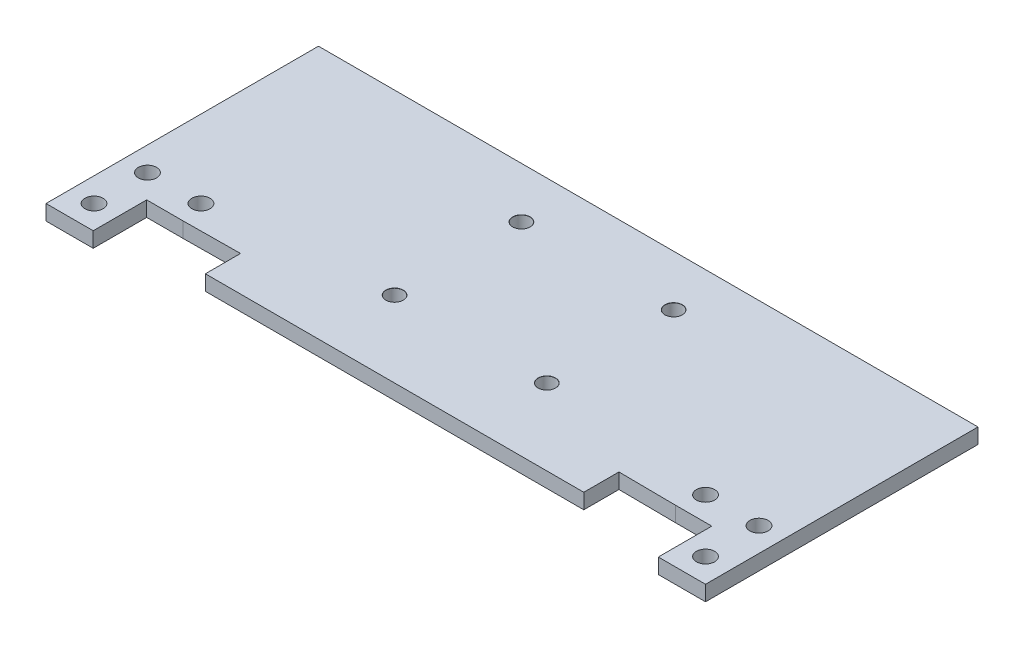
ISO-10303-21;
HEADER;
FILE_DESCRIPTION(('STEP AP214'),'2;1');
FILE_NAME('part.step','',(''),(''),'','','');
FILE_SCHEMA(('AUTOMOTIVE_DESIGN { 1 0 10303 214 1 1 1 1 }'));
ENDSEC;
DATA;
#1=APPLICATION_CONTEXT('core data for automotive mechanical design processes');
#2=APPLICATION_PROTOCOL_DEFINITION('international standard','automotive_design',2000,#1);
#3=PRODUCT_CONTEXT('',#1,'mechanical');
#4=PRODUCT('Part','Part','',(#3));
#5=PRODUCT_RELATED_PRODUCT_CATEGORY('part','',(#4));
#6=PRODUCT_DEFINITION_FORMATION('','',#4);
#7=PRODUCT_DEFINITION_CONTEXT('part definition',#1,'design');
#8=PRODUCT_DEFINITION('design','',#6,#7);
#9=PRODUCT_DEFINITION_SHAPE('','',#8);
#10=(LENGTH_UNIT() NAMED_UNIT(*) SI_UNIT(.MILLI.,.METRE.));
#11=(NAMED_UNIT(*) PLANE_ANGLE_UNIT() SI_UNIT($,.RADIAN.));
#12=(NAMED_UNIT(*) SI_UNIT($,.STERADIAN.) SOLID_ANGLE_UNIT());
#13=UNCERTAINTY_MEASURE_WITH_UNIT(LENGTH_MEASURE(1.E-05),#10,'distance_accuracy_value','');
#14=(GEOMETRIC_REPRESENTATION_CONTEXT(3) GLOBAL_UNCERTAINTY_ASSIGNED_CONTEXT((#13)) GLOBAL_UNIT_ASSIGNED_CONTEXT((#10,
#11,#12)) REPRESENTATION_CONTEXT('',''));
#15=CARTESIAN_POINT('',(0.,0.,0.));
#16=DIRECTION('',(0.,0.,1.));
#17=DIRECTION('',(1.,0.,0.));
#18=AXIS2_PLACEMENT_3D('',#15,#16,#17);
#19=CARTESIAN_POINT('',(130.,3.,-3.71));
#20=DIRECTION('',(0.,-1.,0.));
#21=DIRECTION('',(0.,0.,-1.));
#22=AXIS2_PLACEMENT_3D('',#19,#20,#21);
#23=PLANE('',#22);
#24=CARTESIAN_POINT('',(125.269900039324,3.,-4.72997846201641));
#25=DIRECTION('',(0.,1.,0.));
#26=DIRECTION('',(0.,0.,1.));
#27=AXIS2_PLACEMENT_3D('',#24,#25,#26);
#28=CIRCLE('',#27,1.8);
#29=CARTESIAN_POINT('',(125.269900039324,3.,-2.92997846201641));
#30=VERTEX_POINT('',#29);
#31=EDGE_CURVE('E545',#30,#30,#28,.T.);
#32=ORIENTED_EDGE('',*,*,#31,.F.);
#33=EDGE_LOOP('',(#32));
#34=FACE_BOUND('',#33,.T.);
#35=CARTESIAN_POINT('',(125.269900039324,3.,-15.2697785406255));
#36=DIRECTION('',(0.,1.,0.));
#37=DIRECTION('',(0.,0.,1.));
#38=AXIS2_PLACEMENT_3D('',#35,#36,#37);
#39=CIRCLE('',#38,1.8);
#40=CARTESIAN_POINT('',(125.269900039324,3.,-13.4697785406255));
#41=VERTEX_POINT('',#40);
#42=EDGE_CURVE('E551',#41,#41,#39,.T.);
#43=ORIENTED_EDGE('',*,*,#42,.F.);
#44=EDGE_LOOP('',(#43));
#45=FACE_BOUND('',#44,.T.);
#46=CARTESIAN_POINT('',(114.730099960715,3.,-15.2697785406255));
#47=DIRECTION('',(0.,1.,0.));
#48=DIRECTION('',(0.,0.,1.));
#49=AXIS2_PLACEMENT_3D('',#46,#47,#48);
#50=CIRCLE('',#49,1.79999999999998);
#51=CARTESIAN_POINT('',(114.730099960715,3.,-13.4697785406255));
#52=VERTEX_POINT('',#51);
#53=EDGE_CURVE('E557',#52,#52,#50,.T.);
#54=ORIENTED_EDGE('',*,*,#53,.F.);
#55=EDGE_LOOP('',(#54));
#56=FACE_BOUND('',#55,.T.);
#57=CARTESIAN_POINT('',(80.,3.,-18.71));
#58=DIRECTION('',(0.,1.,0.));
#59=DIRECTION('',(0.,0.,1.));
#60=AXIS2_PLACEMENT_3D('',#57,#58,#59);
#61=CIRCLE('',#60,1.725);
#62=CARTESIAN_POINT('',(80.,3.,-16.985));
#63=VERTEX_POINT('',#62);
#64=EDGE_CURVE('E254',#63,#63,#61,.T.);
#65=ORIENTED_EDGE('',*,*,#64,.F.);
#66=EDGE_LOOP('',(#65));
#67=FACE_BOUND('',#66,.T.);
#68=CARTESIAN_POINT('',(50.,3.,-18.71));
#69=DIRECTION('',(0.,1.,0.));
#70=DIRECTION('',(0.,0.,1.));
#71=AXIS2_PLACEMENT_3D('',#68,#69,#70);
#72=CIRCLE('',#71,1.725);
#73=CARTESIAN_POINT('',(50.,3.,-16.985));
#74=VERTEX_POINT('',#73);
#75=EDGE_CURVE('E245',#74,#74,#72,.T.);
#76=ORIENTED_EDGE('',*,*,#75,.F.);
#77=EDGE_LOOP('',(#76));
#78=FACE_BOUND('',#77,.T.);
#79=CARTESIAN_POINT('',(80.,3.,-43.71));
#80=DIRECTION('',(0.,1.,0.));
#81=DIRECTION('',(0.,0.,1.));
#82=AXIS2_PLACEMENT_3D('',#79,#80,#81);
#83=CIRCLE('',#82,1.725);
#84=CARTESIAN_POINT('',(80.,3.,-41.985));
#85=VERTEX_POINT('',#84);
#86=EDGE_CURVE('E236',#85,#85,#83,.T.);
#87=ORIENTED_EDGE('',*,*,#86,.F.);
#88=EDGE_LOOP('',(#87));
#89=FACE_BOUND('',#88,.T.);
#90=CARTESIAN_POINT('',(50.,3.,-43.71));
#91=DIRECTION('',(0.,1.,0.));
#92=DIRECTION('',(0.,0.,1.));
#93=AXIS2_PLACEMENT_3D('',#90,#91,#92);
#94=CIRCLE('',#93,1.725);
#95=CARTESIAN_POINT('',(50.,3.,-41.985));
#96=VERTEX_POINT('',#95);
#97=EDGE_CURVE('E227',#96,#96,#94,.T.);
#98=ORIENTED_EDGE('',*,*,#97,.F.);
#99=EDGE_LOOP('',(#98));
#100=FACE_BOUND('',#99,.T.);
#101=DIRECTION('',(0.,0.,-1.));
#102=VECTOR('',#101,1.);
#103=CARTESIAN_POINT('',(102.295589790774,3.,0.));
#104=LINE('',#103,#102);
#105=CARTESIAN_POINT('',(102.295589790774,3.,-3.71));
#106=VERTEX_POINT('',#105);
#107=CARTESIAN_POINT('',(102.295589790774,3.,-10.6394114363693));
#108=VERTEX_POINT('',#107);
#109=EDGE_CURVE('E169',#106,#108,#104,.T.);
#110=ORIENTED_EDGE('',*,*,#109,.T.);
#111=DIRECTION('',(-0.999960361646802,0.,-0.00890365852877629));
#112=VECTOR('',#111,1.);
#113=CARTESIAN_POINT('',(0.102835428158548,3.,-11.5493368932758));
#114=LINE('',#113,#112);
#115=CARTESIAN_POINT('',(113.49648019192,3.,-10.539678579773));
#116=VERTEX_POINT('',#115);
#117=EDGE_CURVE('E164',#116,#108,#114,.T.);
#118=ORIENTED_EDGE('',*,*,#117,.F.);
#119=DIRECTION('',(-1.,0.,2.18182915121599E-11));
#120=VECTOR('',#119,1.);
#121=CARTESIAN_POINT('',(-2.29957779643927E-10,3.,-10.5396785772967));
#122=LINE('',#121,#120);
#123=CARTESIAN_POINT('',(120.695589790774,3.,-10.5396785799301));
#124=VERTEX_POINT('',#123);
#125=EDGE_CURVE('E174',#124,#116,#122,.T.);
#126=ORIENTED_EDGE('',*,*,#125,.F.);
#127=DIRECTION('',(0.,0.,1.));
#128=VECTOR('',#127,1.);
#129=CARTESIAN_POINT('',(120.695589790774,3.,0.));
#130=LINE('',#129,#128);
#131=CARTESIAN_POINT('',(120.695589790774,3.,0.00012149865995312));
#132=VERTEX_POINT('',#131);
#133=EDGE_CURVE('E143',#124,#132,#130,.T.);
#134=ORIENTED_EDGE('',*,*,#133,.T.);
#135=DIRECTION('',(-1.,0.,0.));
#136=VECTOR('',#135,1.);
#137=CARTESIAN_POINT('',(0.,3.,0.000121498659939107));
#138=LINE('',#137,#136);
#139=CARTESIAN_POINT('',(130.000000000019,3.,0.000121498659955024));
#140=VERTEX_POINT('',#139);
#141=EDGE_CURVE('E224',#140,#132,#138,.T.);
#142=ORIENTED_EDGE('',*,*,#141,.F.);
#143=DIRECTION('',(0.,0.,1.));
#144=VECTOR('',#143,1.);
#145=CARTESIAN_POINT('',(130.,3.,-3.71));
#146=LINE('',#145,#144);
#147=CARTESIAN_POINT('',(130.,3.,-53.71));
#148=VERTEX_POINT('',#147);
#149=EDGE_CURVE('E267',#148,#140,#146,.T.);
#150=ORIENTED_EDGE('',*,*,#149,.F.);
#151=DIRECTION('',(-1.,0.,0.));
#152=VECTOR('',#151,1.);
#153=CARTESIAN_POINT('',(130.,3.,-53.71));
#154=LINE('',#153,#152);
#155=CARTESIAN_POINT('',(0.,3.,-53.71));
#156=VERTEX_POINT('',#155);
#157=EDGE_CURVE('E286',#148,#156,#154,.T.);
#158=ORIENTED_EDGE('',*,*,#157,.T.);
#159=DIRECTION('',(0.,0.,1.));
#160=VECTOR('',#159,1.);
#161=CARTESIAN_POINT('',(0.,3.,-3.71));
#162=LINE('',#161,#160);
#163=CARTESIAN_POINT('',(0.,3.,0.0001214986599391));
#164=VERTEX_POINT('',#163);
#165=EDGE_CURVE('E275',#156,#164,#162,.T.);
#166=ORIENTED_EDGE('',*,*,#165,.T.);
#167=DIRECTION('',(1.,0.,0.));
#168=VECTOR('',#167,1.);
#169=CARTESIAN_POINT('',(0.,3.,0.0001214986599391));
#170=LINE('',#169,#168);
#171=CARTESIAN_POINT('',(9.3044102092265,3.,0.00012149865994024));
#172=VERTEX_POINT('',#171);
#173=EDGE_CURVE('E213',#164,#172,#170,.T.);
#174=ORIENTED_EDGE('',*,*,#173,.T.);
#175=DIRECTION('',(0.,0.,1.));
#176=VECTOR('',#175,1.);
#177=CARTESIAN_POINT('',(9.3044102092265,3.,0.));
#178=LINE('',#177,#176);
#179=CARTESIAN_POINT('',(9.3044102092265,3.,-10.5396785799301));
#180=VERTEX_POINT('',#179);
#181=EDGE_CURVE('E63',#180,#172,#178,.T.);
#182=ORIENTED_EDGE('',*,*,#181,.F.);
#183=DIRECTION('',(1.,0.,0.));
#184=VECTOR('',#183,1.);
#185=CARTESIAN_POINT('',(0.,3.,-10.5396785799301));
#186=LINE('',#185,#184);
#187=CARTESIAN_POINT('',(16.5035198257214,3.,-10.5396785799301));
#188=VERTEX_POINT('',#187);
#189=EDGE_CURVE('E199',#180,#188,#186,.T.);
#190=ORIENTED_EDGE('',*,*,#189,.T.);
#191=DIRECTION('',(0.999960361646802,0.,-0.00890365852877655));
#192=VECTOR('',#191,1.);
#193=CARTESIAN_POINT('',(-0.092529660582934,3.,-10.3919071649618));
#194=LINE('',#193,#192);
#195=CARTESIAN_POINT('',(27.7044102092266,3.,-10.6394114363693));
#196=VERTEX_POINT('',#195);
#197=EDGE_CURVE('E195',#188,#196,#194,.T.);
#198=ORIENTED_EDGE('',*,*,#197,.T.);
#199=DIRECTION('',(0.,0.,-1.));
#200=VECTOR('',#199,1.);
#201=CARTESIAN_POINT('',(27.7044102092266,3.,0.));
#202=LINE('',#201,#200);
#203=CARTESIAN_POINT('',(27.7044102092266,3.,-3.71));
#204=VERTEX_POINT('',#203);
#205=EDGE_CURVE('E193',#204,#196,#202,.T.);
#206=ORIENTED_EDGE('',*,*,#205,.F.);
#207=DIRECTION('',(-1.,0.,0.));
#208=VECTOR('',#207,1.);
#209=CARTESIAN_POINT('',(130.,3.,-3.71));
#210=LINE('',#209,#208);
#211=EDGE_CURVE('E283',#106,#204,#210,.T.);
#212=ORIENTED_EDGE('',*,*,#211,.F.);
#213=EDGE_LOOP('',(#110,#118,#126,#134,#142,#150,#158,#166,#174,#182,#190,#198,#206,#212));
#214=FACE_BOUND('',#213,.T.);
#215=CARTESIAN_POINT('',(15.2699000392854,3.,-15.2697785406255));
#216=DIRECTION('',(0.,1.,0.));
#217=DIRECTION('',(0.,0.,1.));
#218=AXIS2_PLACEMENT_3D('',#215,#216,#217);
#219=CIRCLE('',#218,1.79999999999999);
#220=CARTESIAN_POINT('',(15.2699000392854,3.,-13.4697785406255));
#221=VERTEX_POINT('',#220);
#222=EDGE_CURVE('E539',#221,#221,#219,.T.);
#223=ORIENTED_EDGE('',*,*,#222,.F.);
#224=EDGE_LOOP('',(#223));
#225=FACE_BOUND('',#224,.T.);
#226=CARTESIAN_POINT('',(4.73009996067636,3.,-15.2697785406255));
#227=DIRECTION('',(0.,1.,0.));
#228=DIRECTION('',(0.,0.,1.));
#229=AXIS2_PLACEMENT_3D('',#226,#227,#228);
#230=CIRCLE('',#229,1.79999999999999);
#231=CARTESIAN_POINT('',(4.73009996067636,3.,-13.4697785406255));
#232=VERTEX_POINT('',#231);
#233=EDGE_CURVE('E531',#232,#232,#230,.T.);
#234=ORIENTED_EDGE('',*,*,#233,.F.);
#235=EDGE_LOOP('',(#234));
#236=FACE_BOUND('',#235,.T.);
#237=CARTESIAN_POINT('',(4.73009996067636,3.,-4.72997846201641));
#238=DIRECTION('',(0.,1.,0.));
#239=DIRECTION('',(0.,0.,1.));
#240=AXIS2_PLACEMENT_3D('',#237,#238,#239);
#241=CIRCLE('',#240,1.79999999999999);
#242=CARTESIAN_POINT('',(4.73009996067636,3.,-2.92997846201642));
#243=VERTEX_POINT('',#242);
#244=EDGE_CURVE('E528',#243,#243,#241,.T.);
#245=ORIENTED_EDGE('',*,*,#244,.F.);
#246=EDGE_LOOP('',(#245));
#247=FACE_BOUND('',#246,.T.);
#248=ADVANCED_FACE('F41',(#34,#45,#56,#67,#78,#89,#100,#214,#225,#236,#247),#23,.F.);
#249=CARTESIAN_POINT('',(130.,3.,-3.71));
#250=DIRECTION('',(0.,0.,-1.));
#251=DIRECTION('',(-1.,0.,0.));
#252=AXIS2_PLACEMENT_3D('',#249,#250,#251);
#253=PLANE('',#252);
#254=DIRECTION('',(0.,-1.,0.));
#255=VECTOR('',#254,1.);
#256=CARTESIAN_POINT('',(102.295589790774,3.,-3.71));
#257=LINE('',#256,#255);
#258=CARTESIAN_POINT('',(102.295589790774,0.,-3.71));
#259=VERTEX_POINT('',#258);
#260=EDGE_CURVE('E210',#106,#259,#257,.T.);
#261=ORIENTED_EDGE('',*,*,#260,.F.);
#262=ORIENTED_EDGE('',*,*,#211,.T.);
#263=DIRECTION('',(0.,-1.,0.));
#264=VECTOR('',#263,1.);
#265=CARTESIAN_POINT('',(27.7044102092266,3.,-3.71));
#266=LINE('',#265,#264);
#267=CARTESIAN_POINT('',(27.7044102092266,0.,-3.71));
#268=VERTEX_POINT('',#267);
#269=EDGE_CURVE('E180',#204,#268,#266,.T.);
#270=ORIENTED_EDGE('',*,*,#269,.T.);
#271=DIRECTION('',(-1.,0.,0.));
#272=VECTOR('',#271,1.);
#273=CARTESIAN_POINT('',(130.,0.,-3.71));
#274=LINE('',#273,#272);
#275=EDGE_CURVE('E280',#259,#268,#274,.T.);
#276=ORIENTED_EDGE('',*,*,#275,.F.);
#277=EDGE_LOOP('',(#261,#262,#270,#276));
#278=FACE_BOUND('',#277,.T.);
#279=ADVANCED_FACE('F322',(#278),#253,.F.);
#280=CARTESIAN_POINT('',(130.,0.,-3.71));
#281=DIRECTION('',(0.,1.,0.));
#282=DIRECTION('',(0.,0.,1.));
#283=AXIS2_PLACEMENT_3D('',#280,#281,#282);
#284=PLANE('',#283);
#285=CARTESIAN_POINT('',(4.73009996067636,0.,-4.72997846201641));
#286=DIRECTION('',(0.,1.,0.));
#287=DIRECTION('',(0.,0.,1.));
#288=AXIS2_PLACEMENT_3D('',#285,#286,#287);
#289=CIRCLE('',#288,1.8);
#290=CARTESIAN_POINT('',(4.73009996067636,0.,-2.92997846201641));
#291=VERTEX_POINT('',#290);
#292=EDGE_CURVE('E525',#291,#291,#289,.T.);
#293=ORIENTED_EDGE('',*,*,#292,.T.);
#294=EDGE_LOOP('',(#293));
#295=FACE_BOUND('',#294,.T.);
#296=CARTESIAN_POINT('',(4.73009996067636,0.,-15.2697785406255));
#297=DIRECTION('',(0.,1.,0.));
#298=DIRECTION('',(0.,0.,1.));
#299=AXIS2_PLACEMENT_3D('',#296,#297,#298);
#300=CIRCLE('',#299,1.8);
#301=CARTESIAN_POINT('',(4.73009996067636,0.,-13.4697785406255));
#302=VERTEX_POINT('',#301);
#303=EDGE_CURVE('E536',#302,#302,#300,.T.);
#304=ORIENTED_EDGE('',*,*,#303,.T.);
#305=EDGE_LOOP('',(#304));
#306=FACE_BOUND('',#305,.T.);
#307=CARTESIAN_POINT('',(15.2699000392854,0.,-15.2697785406255));
#308=DIRECTION('',(0.,1.,0.));
#309=DIRECTION('',(0.,0.,1.));
#310=AXIS2_PLACEMENT_3D('',#307,#308,#309);
#311=CIRCLE('',#310,1.8);
#312=CARTESIAN_POINT('',(15.2699000392854,0.,-13.4697785406255));
#313=VERTEX_POINT('',#312);
#314=EDGE_CURVE('E542',#313,#313,#311,.T.);
#315=ORIENTED_EDGE('',*,*,#314,.T.);
#316=EDGE_LOOP('',(#315));
#317=FACE_BOUND('',#316,.T.);
#318=CARTESIAN_POINT('',(125.269900039324,0.,-4.72997846201641));
#319=DIRECTION('',(0.,1.,0.));
#320=DIRECTION('',(0.,0.,1.));
#321=AXIS2_PLACEMENT_3D('',#318,#319,#320);
#322=CIRCLE('',#321,1.8);
#323=CARTESIAN_POINT('',(125.269900039324,0.,-2.92997846201641));
#324=VERTEX_POINT('',#323);
#325=EDGE_CURVE('E548',#324,#324,#322,.T.);
#326=ORIENTED_EDGE('',*,*,#325,.T.);
#327=EDGE_LOOP('',(#326));
#328=FACE_BOUND('',#327,.T.);
#329=CARTESIAN_POINT('',(125.269900039324,0.,-15.2697785406255));
#330=DIRECTION('',(0.,1.,0.));
#331=DIRECTION('',(0.,0.,1.));
#332=AXIS2_PLACEMENT_3D('',#329,#330,#331);
#333=CIRCLE('',#332,1.8);
#334=CARTESIAN_POINT('',(125.269900039324,0.,-13.4697785406255));
#335=VERTEX_POINT('',#334);
#336=EDGE_CURVE('E554',#335,#335,#333,.T.);
#337=ORIENTED_EDGE('',*,*,#336,.T.);
#338=EDGE_LOOP('',(#337));
#339=FACE_BOUND('',#338,.T.);
#340=CARTESIAN_POINT('',(114.730099960715,0.,-15.2697785406255));
#341=DIRECTION('',(0.,1.,0.));
#342=DIRECTION('',(0.,0.,1.));
#343=AXIS2_PLACEMENT_3D('',#340,#341,#342);
#344=CIRCLE('',#343,1.8);
#345=CARTESIAN_POINT('',(114.730099960715,0.,-13.4697785406255));
#346=VERTEX_POINT('',#345);
#347=EDGE_CURVE('E196',#346,#346,#344,.T.);
#348=ORIENTED_EDGE('',*,*,#347,.T.);
#349=EDGE_LOOP('',(#348));
#350=FACE_BOUND('',#349,.T.);
#351=CARTESIAN_POINT('',(80.,0.,-18.71));
#352=DIRECTION('',(0.,1.,0.));
#353=DIRECTION('',(0.,0.,1.));
#354=AXIS2_PLACEMENT_3D('',#351,#352,#353);
#355=CIRCLE('',#354,1.69999999999999);
#356=CARTESIAN_POINT('',(80.,0.,-17.01));
#357=VERTEX_POINT('',#356);
#358=EDGE_CURVE('E260',#357,#357,#355,.T.);
#359=ORIENTED_EDGE('',*,*,#358,.T.);
#360=EDGE_LOOP('',(#359));
#361=FACE_BOUND('',#360,.T.);
#362=CARTESIAN_POINT('',(50.,0.,-18.71));
#363=DIRECTION('',(0.,1.,0.));
#364=DIRECTION('',(0.,0.,1.));
#365=AXIS2_PLACEMENT_3D('',#362,#363,#364);
#366=CIRCLE('',#365,1.7);
#367=CARTESIAN_POINT('',(50.,0.,-17.01));
#368=VERTEX_POINT('',#367);
#369=EDGE_CURVE('E251',#368,#368,#366,.T.);
#370=ORIENTED_EDGE('',*,*,#369,.T.);
#371=EDGE_LOOP('',(#370));
#372=FACE_BOUND('',#371,.T.);
#373=CARTESIAN_POINT('',(80.,0.,-43.71));
#374=DIRECTION('',(0.,1.,0.));
#375=DIRECTION('',(0.,0.,1.));
#376=AXIS2_PLACEMENT_3D('',#373,#374,#375);
#377=CIRCLE('',#376,1.69999999999999);
#378=CARTESIAN_POINT('',(80.,0.,-42.01));
#379=VERTEX_POINT('',#378);
#380=EDGE_CURVE('E242',#379,#379,#377,.T.);
#381=ORIENTED_EDGE('',*,*,#380,.T.);
#382=EDGE_LOOP('',(#381));
#383=FACE_BOUND('',#382,.T.);
#384=CARTESIAN_POINT('',(50.,0.,-43.71));
#385=DIRECTION('',(0.,1.,0.));
#386=DIRECTION('',(0.,0.,1.));
#387=AXIS2_PLACEMENT_3D('',#384,#385,#386);
#388=CIRCLE('',#387,1.7);
#389=CARTESIAN_POINT('',(50.,0.,-42.01));
#390=VERTEX_POINT('',#389);
#391=EDGE_CURVE('E233',#390,#390,#388,.T.);
#392=ORIENTED_EDGE('',*,*,#391,.T.);
#393=EDGE_LOOP('',(#392));
#394=FACE_BOUND('',#393,.T.);
#395=DIRECTION('',(0.,0.,-1.));
#396=VECTOR('',#395,1.);
#397=CARTESIAN_POINT('',(102.295589790774,0.,0.));
#398=LINE('',#397,#396);
#399=CARTESIAN_POINT('',(102.295589790774,0.,-10.6394114363693));
#400=VERTEX_POINT('',#399);
#401=EDGE_CURVE('E162',#259,#400,#398,.T.);
#402=ORIENTED_EDGE('',*,*,#401,.F.);
#403=ORIENTED_EDGE('',*,*,#275,.T.);
#404=DIRECTION('',(0.,0.,-1.));
#405=VECTOR('',#404,1.);
#406=CARTESIAN_POINT('',(27.7044102092266,0.,0.));
#407=LINE('',#406,#405);
#408=CARTESIAN_POINT('',(27.7044102092266,0.,-10.6394114363693));
#409=VERTEX_POINT('',#408);
#410=EDGE_CURVE('E182',#268,#409,#407,.T.);
#411=ORIENTED_EDGE('',*,*,#410,.T.);
#412=DIRECTION('',(0.999960361646802,0.,-0.00890365852877655));
#413=VECTOR('',#412,1.);
#414=CARTESIAN_POINT('',(-0.092529660582934,0.,-10.3919071649618));
#415=LINE('',#414,#413);
#416=CARTESIAN_POINT('',(16.5035198257214,0.,-10.5396785799301));
#417=VERTEX_POINT('',#416);
#418=EDGE_CURVE('E185',#417,#409,#415,.T.);
#419=ORIENTED_EDGE('',*,*,#418,.F.);
#420=DIRECTION('',(1.,0.,0.));
#421=VECTOR('',#420,1.);
#422=CARTESIAN_POINT('',(0.,0.,-10.5396785799301));
#423=LINE('',#422,#421);
#424=CARTESIAN_POINT('',(9.3044102092265,0.,-10.5396785799301));
#425=VERTEX_POINT('',#424);
#426=EDGE_CURVE('E187',#425,#417,#423,.T.);
#427=ORIENTED_EDGE('',*,*,#426,.F.);
#428=DIRECTION('',(0.,0.,1.));
#429=VECTOR('',#428,1.);
#430=CARTESIAN_POINT('',(9.3044102092265,0.,0.));
#431=LINE('',#430,#429);
#432=CARTESIAN_POINT('',(9.3044102092265,0.,0.000121498659941005));
#433=VERTEX_POINT('',#432);
#434=EDGE_CURVE('E189',#425,#433,#431,.T.);
#435=ORIENTED_EDGE('',*,*,#434,.T.);
#436=DIRECTION('',(-1.,0.,0.));
#437=VECTOR('',#436,1.);
#438=CARTESIAN_POINT('',(0.,0.,0.0001214986599391));
#439=LINE('',#438,#437);
#440=CARTESIAN_POINT('',(0.,0.,0.0001214986599391));
#441=VERTEX_POINT('',#440);
#442=EDGE_CURVE('E212',#433,#441,#439,.T.);
#443=ORIENTED_EDGE('',*,*,#442,.T.);
#444=DIRECTION('',(0.,0.,-1.));
#445=VECTOR('',#444,1.);
#446=CARTESIAN_POINT('',(0.,0.,-3.71));
#447=LINE('',#446,#445);
#448=CARTESIAN_POINT('',(0.,0.,-53.71));
#449=VERTEX_POINT('',#448);
#450=EDGE_CURVE('E268',#441,#449,#447,.T.);
#451=ORIENTED_EDGE('',*,*,#450,.T.);
#452=DIRECTION('',(-1.,0.,0.));
#453=VECTOR('',#452,1.);
#454=CARTESIAN_POINT('',(130.,0.,-53.71));
#455=LINE('',#454,#453);
#456=CARTESIAN_POINT('',(130.,0.,-53.71));
#457=VERTEX_POINT('',#456);
#458=EDGE_CURVE('E272',#457,#449,#455,.T.);
#459=ORIENTED_EDGE('',*,*,#458,.F.);
#460=DIRECTION('',(0.,0.,-1.));
#461=VECTOR('',#460,1.);
#462=CARTESIAN_POINT('',(130.,0.,-3.71));
#463=LINE('',#462,#461);
#464=CARTESIAN_POINT('',(130.000000000019,0.,0.000121498659955024));
#465=VERTEX_POINT('',#464);
#466=EDGE_CURVE('E270',#465,#457,#463,.T.);
#467=ORIENTED_EDGE('',*,*,#466,.F.);
#468=DIRECTION('',(1.,0.,0.));
#469=VECTOR('',#468,1.);
#470=CARTESIAN_POINT('',(0.,0.,0.000121498659939107));
#471=LINE('',#470,#469);
#472=CARTESIAN_POINT('',(120.695589790774,0.,0.000121498659953885));
#473=VERTEX_POINT('',#472);
#474=EDGE_CURVE('E161',#473,#465,#471,.T.);
#475=ORIENTED_EDGE('',*,*,#474,.F.);
#476=DIRECTION('',(0.,0.,1.));
#477=VECTOR('',#476,1.);
#478=CARTESIAN_POINT('',(120.695589790774,0.,0.));
#479=LINE('',#478,#477);
#480=CARTESIAN_POINT('',(120.695589790774,0.,-10.5396785799301));
#481=VERTEX_POINT('',#480);
#482=EDGE_CURVE('E55',#481,#473,#479,.T.);
#483=ORIENTED_EDGE('',*,*,#482,.F.);
#484=DIRECTION('',(-1.,0.,2.18182915121599E-11));
#485=VECTOR('',#484,1.);
#486=CARTESIAN_POINT('',(-2.29957779643927E-10,0.,-10.5396785772967));
#487=LINE('',#486,#485);
#488=CARTESIAN_POINT('',(113.49648019192,0.,-10.539678579773));
#489=VERTEX_POINT('',#488);
#490=EDGE_CURVE('E151',#481,#489,#487,.T.);
#491=ORIENTED_EDGE('',*,*,#490,.T.);
#492=DIRECTION('',(-0.999960361646802,0.,-0.00890365852877629));
#493=VECTOR('',#492,1.);
#494=CARTESIAN_POINT('',(0.102835428158548,0.,-11.5493368932758));
#495=LINE('',#494,#493);
#496=EDGE_CURVE('E148',#489,#400,#495,.T.);
#497=ORIENTED_EDGE('',*,*,#496,.T.);
#498=EDGE_LOOP('',(#402,#403,#411,#419,#427,#435,#443,#451,#459,#467,#475,#483,#491,#497));
#499=FACE_BOUND('',#498,.T.);
#500=ADVANCED_FACE('F159',(#295,#306,#317,#328,#339,#350,#361,#372,#383,#394,#499),#284,.F.);
#501=CARTESIAN_POINT('',(0.,25.1178051828791,0.000121498659939107));
#502=DIRECTION('',(0.,0.,-1.));
#503=DIRECTION('',(-1.,0.,0.));
#504=AXIS2_PLACEMENT_3D('',#501,#502,#503);
#505=PLANE('',#504);
#506=DIRECTION('',(0.,1.,0.));
#507=VECTOR('',#506,1.);
#508=CARTESIAN_POINT('',(120.695589790774,25.1178051828791,0.000121498659953885));
#509=LINE('',#508,#507);
#510=EDGE_CURVE('E11',#473,#132,#509,.T.);
#511=ORIENTED_EDGE('',*,*,#510,.F.);
#512=ORIENTED_EDGE('',*,*,#474,.T.);
#513=DIRECTION('',(0.,-1.,0.));
#514=VECTOR('',#513,1.);
#515=CARTESIAN_POINT('',(130.000000000019,25.1178051828791,0.000121498659955024));
#516=LINE('',#515,#514);
#517=EDGE_CURVE('E221',#140,#465,#516,.T.);
#518=ORIENTED_EDGE('',*,*,#517,.F.);
#519=ORIENTED_EDGE('',*,*,#141,.T.);
#520=EDGE_LOOP('',(#511,#512,#518,#519));
#521=FACE_BOUND('',#520,.T.);
#522=ADVANCED_FACE('F310',(#521),#505,.F.);
#523=CARTESIAN_POINT('',(130.,0.,-53.71));
#524=DIRECTION('',(0.,0.,1.));
#525=DIRECTION('',(1.,0.,0.));
#526=AXIS2_PLACEMENT_3D('',#523,#524,#525);
#527=PLANE('',#526);
#528=DIRECTION('',(0.,1.,0.));
#529=VECTOR('',#528,1.);
#530=CARTESIAN_POINT('',(0.,0.,-53.71));
#531=LINE('',#530,#529);
#532=EDGE_CURVE('E263',#449,#156,#531,.T.);
#533=ORIENTED_EDGE('',*,*,#532,.T.);
#534=ORIENTED_EDGE('',*,*,#157,.F.);
#535=DIRECTION('',(0.,1.,0.));
#536=VECTOR('',#535,1.);
#537=CARTESIAN_POINT('',(130.,0.,-53.71));
#538=LINE('',#537,#536);
#539=EDGE_CURVE('E264',#457,#148,#538,.T.);
#540=ORIENTED_EDGE('',*,*,#539,.F.);
#541=ORIENTED_EDGE('',*,*,#458,.T.);
#542=EDGE_LOOP('',(#533,#534,#540,#541));
#543=FACE_BOUND('',#542,.T.);
#544=ADVANCED_FACE('F43',(#543),#527,.F.);
#545=CARTESIAN_POINT('',(130.,0.,0.));
#546=DIRECTION('',(-1.,0.,0.));
#547=DIRECTION('',(0.,0.,1.));
#548=AXIS2_PLACEMENT_3D('',#545,#546,#547);
#549=PLANE('',#548);
#550=ORIENTED_EDGE('',*,*,#539,.T.);
#551=ORIENTED_EDGE('',*,*,#149,.T.);
#552=ORIENTED_EDGE('',*,*,#517,.T.);
#553=ORIENTED_EDGE('',*,*,#466,.T.);
#554=EDGE_LOOP('',(#550,#551,#552,#553));
#555=FACE_BOUND('',#554,.T.);
#556=ADVANCED_FACE('F306',(#555),#549,.F.);
#557=CARTESIAN_POINT('',(0.,0.,0.));
#558=DIRECTION('',(-1.,0.,0.));
#559=DIRECTION('',(0.,0.,1.));
#560=AXIS2_PLACEMENT_3D('',#557,#558,#559);
#561=PLANE('',#560);
#562=ORIENTED_EDGE('',*,*,#532,.F.);
#563=ORIENTED_EDGE('',*,*,#450,.F.);
#564=DIRECTION('',(0.,-1.,0.));
#565=VECTOR('',#564,1.);
#566=CARTESIAN_POINT('',(0.,25.1178051828791,0.0001214986599391));
#567=LINE('',#566,#565);
#568=EDGE_CURVE('E216',#164,#441,#567,.T.);
#569=ORIENTED_EDGE('',*,*,#568,.F.);
#570=ORIENTED_EDGE('',*,*,#165,.F.);
#571=EDGE_LOOP('',(#562,#563,#569,#570));
#572=FACE_BOUND('',#571,.T.);
#573=ADVANCED_FACE('F300',(#572),#561,.T.);
#574=CARTESIAN_POINT('',(80.,3.,-18.71));
#575=DIRECTION('',(0.,1.,0.));
#576=DIRECTION('',(0.,0.,1.));
#577=AXIS2_PLACEMENT_3D('',#574,#575,#576);
#578=CYLINDRICAL_SURFACE('',#577,1.69999999999999);
#579=ORIENTED_EDGE('',*,*,#358,.F.);
#580=EDGE_LOOP('',(#579));
#581=FACE_BOUND('',#580,.T.);
#582=CARTESIAN_POINT('',(80.,2.97499999999998,-18.71));
#583=DIRECTION('',(0.,1.,0.));
#584=DIRECTION('',(0.,0.,1.));
#585=AXIS2_PLACEMENT_3D('',#582,#583,#584);
#586=CIRCLE('',#585,1.69999999999999);
#587=CARTESIAN_POINT('',(80.,2.97499999999998,-17.01));
#588=VERTEX_POINT('',#587);
#589=EDGE_CURVE('E257',#588,#588,#586,.T.);
#590=ORIENTED_EDGE('',*,*,#589,.T.);
#591=EDGE_LOOP('',(#590));
#592=FACE_BOUND('',#591,.T.);
#593=ADVANCED_FACE('F358',(#581,#592),#578,.F.);
#594=CARTESIAN_POINT('',(80.,3.,-18.71));
#595=DIRECTION('',(0.,1.,0.));
#596=DIRECTION('',(0.,0.,1.));
#597=AXIS2_PLACEMENT_3D('',#594,#595,#596);
#598=CONICAL_SURFACE('',#597,1.725,0.785398163397136);
#599=ORIENTED_EDGE('',*,*,#589,.F.);
#600=EDGE_LOOP('',(#599));
#601=FACE_BOUND('',#600,.T.);
#602=ORIENTED_EDGE('',*,*,#64,.T.);
#603=EDGE_LOOP('',(#602));
#604=FACE_BOUND('',#603,.T.);
#605=ADVANCED_FACE('F363',(#601,#604),#598,.F.);
#606=CARTESIAN_POINT('',(50.,3.,-18.71));
#607=DIRECTION('',(0.,1.,0.));
#608=DIRECTION('',(0.,0.,1.));
#609=AXIS2_PLACEMENT_3D('',#606,#607,#608);
#610=CYLINDRICAL_SURFACE('',#609,1.69999999999999);
#611=ORIENTED_EDGE('',*,*,#369,.F.);
#612=EDGE_LOOP('',(#611));
#613=FACE_BOUND('',#612,.T.);
#614=CARTESIAN_POINT('',(50.,2.97499999999998,-18.71));
#615=DIRECTION('',(0.,1.,0.));
#616=DIRECTION('',(0.,0.,1.));
#617=AXIS2_PLACEMENT_3D('',#614,#615,#616);
#618=CIRCLE('',#617,1.69999999999999);
#619=CARTESIAN_POINT('',(50.,2.97499999999998,-17.01));
#620=VERTEX_POINT('',#619);
#621=EDGE_CURVE('E248',#620,#620,#618,.T.);
#622=ORIENTED_EDGE('',*,*,#621,.T.);
#623=EDGE_LOOP('',(#622));
#624=FACE_BOUND('',#623,.T.);
#625=ADVANCED_FACE('F367',(#613,#624),#610,.F.);
#626=CARTESIAN_POINT('',(50.,3.,-18.71));
#627=DIRECTION('',(0.,1.,0.));
#628=DIRECTION('',(0.,0.,1.));
#629=AXIS2_PLACEMENT_3D('',#626,#627,#628);
#630=CONICAL_SURFACE('',#629,1.725,0.785398163397275);
#631=ORIENTED_EDGE('',*,*,#621,.F.);
#632=EDGE_LOOP('',(#631));
#633=FACE_BOUND('',#632,.T.);
#634=ORIENTED_EDGE('',*,*,#75,.T.);
#635=EDGE_LOOP('',(#634));
#636=FACE_BOUND('',#635,.T.);
#637=ADVANCED_FACE('F371',(#633,#636),#630,.F.);
#638=CARTESIAN_POINT('',(80.,3.,-43.71));
#639=DIRECTION('',(0.,1.,0.));
#640=DIRECTION('',(0.,0.,1.));
#641=AXIS2_PLACEMENT_3D('',#638,#639,#640);
#642=CYLINDRICAL_SURFACE('',#641,1.69999999999999);
#643=ORIENTED_EDGE('',*,*,#380,.F.);
#644=EDGE_LOOP('',(#643));
#645=FACE_BOUND('',#644,.T.);
#646=CARTESIAN_POINT('',(80.,2.97499999999998,-43.71));
#647=DIRECTION('',(0.,1.,0.));
#648=DIRECTION('',(0.,0.,1.));
#649=AXIS2_PLACEMENT_3D('',#646,#647,#648);
#650=CIRCLE('',#649,1.69999999999999);
#651=CARTESIAN_POINT('',(80.,2.97499999999998,-42.01));
#652=VERTEX_POINT('',#651);
#653=EDGE_CURVE('E239',#652,#652,#650,.T.);
#654=ORIENTED_EDGE('',*,*,#653,.T.);
#655=EDGE_LOOP('',(#654));
#656=FACE_BOUND('',#655,.T.);
#657=ADVANCED_FACE('F375',(#645,#656),#642,.F.);
#658=CARTESIAN_POINT('',(80.,3.,-43.71));
#659=DIRECTION('',(0.,1.,0.));
#660=DIRECTION('',(0.,0.,1.));
#661=AXIS2_PLACEMENT_3D('',#658,#659,#660);
#662=CONICAL_SURFACE('',#661,1.725,0.785398163397136);
#663=ORIENTED_EDGE('',*,*,#653,.F.);
#664=EDGE_LOOP('',(#663));
#665=FACE_BOUND('',#664,.T.);
#666=ORIENTED_EDGE('',*,*,#86,.T.);
#667=EDGE_LOOP('',(#666));
#668=FACE_BOUND('',#667,.T.);
#669=ADVANCED_FACE('F379',(#665,#668),#662,.F.);
#670=CARTESIAN_POINT('',(50.,3.,-43.71));
#671=DIRECTION('',(0.,1.,0.));
#672=DIRECTION('',(0.,0.,1.));
#673=AXIS2_PLACEMENT_3D('',#670,#671,#672);
#674=CYLINDRICAL_SURFACE('',#673,1.69999999999999);
#675=ORIENTED_EDGE('',*,*,#391,.F.);
#676=EDGE_LOOP('',(#675));
#677=FACE_BOUND('',#676,.T.);
#678=CARTESIAN_POINT('',(50.,2.97499999999998,-43.71));
#679=DIRECTION('',(0.,1.,0.));
#680=DIRECTION('',(0.,0.,1.));
#681=AXIS2_PLACEMENT_3D('',#678,#679,#680);
#682=CIRCLE('',#681,1.69999999999999);
#683=CARTESIAN_POINT('',(50.,2.97499999999998,-42.01));
#684=VERTEX_POINT('',#683);
#685=EDGE_CURVE('E230',#684,#684,#682,.T.);
#686=ORIENTED_EDGE('',*,*,#685,.T.);
#687=EDGE_LOOP('',(#686));
#688=FACE_BOUND('',#687,.T.);
#689=ADVANCED_FACE('F383',(#677,#688),#674,.F.);
#690=CARTESIAN_POINT('',(50.,3.,-43.71));
#691=DIRECTION('',(0.,1.,0.));
#692=DIRECTION('',(0.,0.,1.));
#693=AXIS2_PLACEMENT_3D('',#690,#691,#692);
#694=CONICAL_SURFACE('',#693,1.725,0.785398163397275);
#695=ORIENTED_EDGE('',*,*,#685,.F.);
#696=EDGE_LOOP('',(#695));
#697=FACE_BOUND('',#696,.T.);
#698=ORIENTED_EDGE('',*,*,#97,.T.);
#699=EDGE_LOOP('',(#698));
#700=FACE_BOUND('',#699,.T.);
#701=ADVANCED_FACE('F387',(#697,#700),#694,.F.);
#702=CARTESIAN_POINT('',(0.,25.1178051828791,0.0001214986599391));
#703=DIRECTION('',(0.,0.,1.));
#704=DIRECTION('',(1.,0.,0.));
#705=AXIS2_PLACEMENT_3D('',#702,#703,#704);
#706=PLANE('',#705);
#707=DIRECTION('',(0.,-1.,0.));
#708=VECTOR('',#707,1.);
#709=CARTESIAN_POINT('',(9.3044102092265,25.1178051828791,0.00012149865994024));
#710=LINE('',#709,#708);
#711=EDGE_CURVE('E49',#172,#433,#710,.T.);
#712=ORIENTED_EDGE('',*,*,#711,.F.);
#713=ORIENTED_EDGE('',*,*,#173,.F.);
#714=ORIENTED_EDGE('',*,*,#568,.T.);
#715=ORIENTED_EDGE('',*,*,#442,.F.);
#716=EDGE_LOOP('',(#712,#713,#714,#715));
#717=FACE_BOUND('',#716,.T.);
#718=ADVANCED_FACE('F296',(#717),#706,.T.);
#719=CARTESIAN_POINT('',(27.7044102092266,0.,0.));
#720=DIRECTION('',(1.,0.,0.));
#721=DIRECTION('',(0.,0.,-1.));
#722=AXIS2_PLACEMENT_3D('',#719,#720,#721);
#723=PLANE('',#722);
#724=ORIENTED_EDGE('',*,*,#205,.T.);
#725=DIRECTION('',(0.,1.,0.));
#726=VECTOR('',#725,1.);
#727=CARTESIAN_POINT('',(27.7044102092266,0.,-10.6394114363693));
#728=LINE('',#727,#726);
#729=EDGE_CURVE('E192',#409,#196,#728,.T.);
#730=ORIENTED_EDGE('',*,*,#729,.F.);
#731=ORIENTED_EDGE('',*,*,#410,.F.);
#732=ORIENTED_EDGE('',*,*,#269,.F.);
#733=EDGE_LOOP('',(#724,#730,#731,#732));
#734=FACE_BOUND('',#733,.T.);
#735=ADVANCED_FACE('F325',(#734),#723,.F.);
#736=CARTESIAN_POINT('',(9.3044102092265,0.,0.));
#737=DIRECTION('',(-1.,0.,0.));
#738=DIRECTION('',(0.,0.,1.));
#739=AXIS2_PLACEMENT_3D('',#736,#737,#738);
#740=PLANE('',#739);
#741=ORIENTED_EDGE('',*,*,#711,.T.);
#742=ORIENTED_EDGE('',*,*,#434,.F.);
#743=DIRECTION('',(0.,1.,0.));
#744=VECTOR('',#743,1.);
#745=CARTESIAN_POINT('',(9.3044102092265,0.,-10.5396785799301));
#746=LINE('',#745,#744);
#747=EDGE_CURVE('E172',#425,#180,#746,.T.);
#748=ORIENTED_EDGE('',*,*,#747,.T.);
#749=ORIENTED_EDGE('',*,*,#181,.T.);
#750=EDGE_LOOP('',(#741,#742,#748,#749));
#751=FACE_BOUND('',#750,.T.);
#752=ADVANCED_FACE('F289',(#751),#740,.F.);
#753=CARTESIAN_POINT('',(0.,0.,-10.5396785799301));
#754=DIRECTION('',(0.,0.,1.));
#755=DIRECTION('',(1.,0.,0.));
#756=AXIS2_PLACEMENT_3D('',#753,#754,#755);
#757=PLANE('',#756);
#758=ORIENTED_EDGE('',*,*,#189,.F.);
#759=ORIENTED_EDGE('',*,*,#747,.F.);
#760=ORIENTED_EDGE('',*,*,#426,.T.);
#761=DIRECTION('',(0.,1.,0.));
#762=VECTOR('',#761,1.);
#763=CARTESIAN_POINT('',(16.5035198257214,0.,-10.5396785799301));
#764=LINE('',#763,#762);
#765=EDGE_CURVE('E204',#417,#188,#764,.T.);
#766=ORIENTED_EDGE('',*,*,#765,.T.);
#767=EDGE_LOOP('',(#758,#759,#760,#766));
#768=FACE_BOUND('',#767,.T.);
#769=ADVANCED_FACE('F333',(#768),#757,.T.);
#770=CARTESIAN_POINT('',(-0.092529660582934,0.,-10.3919071649618));
#771=DIRECTION('',(0.00890365852877655,0.,0.999960361646802));
#772=DIRECTION('',(0.999960361646802,0.,-0.00890365852877655));
#773=AXIS2_PLACEMENT_3D('',#770,#771,#772);
#774=PLANE('',#773);
#775=ORIENTED_EDGE('',*,*,#197,.F.);
#776=ORIENTED_EDGE('',*,*,#765,.F.);
#777=ORIENTED_EDGE('',*,*,#418,.T.);
#778=ORIENTED_EDGE('',*,*,#729,.T.);
#779=EDGE_LOOP('',(#775,#776,#777,#778));
#780=FACE_BOUND('',#779,.T.);
#781=ADVANCED_FACE('F331',(#780),#774,.T.);
#782=CARTESIAN_POINT('',(102.295589790774,0.,0.));
#783=DIRECTION('',(1.,0.,0.));
#784=DIRECTION('',(0.,0.,-1.));
#785=AXIS2_PLACEMENT_3D('',#782,#783,#784);
#786=PLANE('',#785);
#787=ORIENTED_EDGE('',*,*,#260,.T.);
#788=ORIENTED_EDGE('',*,*,#401,.T.);
#789=DIRECTION('',(0.,1.,0.));
#790=VECTOR('',#789,1.);
#791=CARTESIAN_POINT('',(102.295589790774,0.,-10.6394114363693));
#792=LINE('',#791,#790);
#793=EDGE_CURVE('E178',#400,#108,#792,.T.);
#794=ORIENTED_EDGE('',*,*,#793,.T.);
#795=ORIENTED_EDGE('',*,*,#109,.F.);
#796=EDGE_LOOP('',(#787,#788,#794,#795));
#797=FACE_BOUND('',#796,.T.);
#798=ADVANCED_FACE('F340',(#797),#786,.T.);
#799=CARTESIAN_POINT('',(120.695589790774,0.,0.));
#800=DIRECTION('',(-1.,0.,0.));
#801=DIRECTION('',(0.,0.,1.));
#802=AXIS2_PLACEMENT_3D('',#799,#800,#801);
#803=PLANE('',#802);
#804=ORIENTED_EDGE('',*,*,#510,.T.);
#805=ORIENTED_EDGE('',*,*,#133,.F.);
#806=DIRECTION('',(0.,1.,0.));
#807=VECTOR('',#806,1.);
#808=CARTESIAN_POINT('',(120.695589790774,0.,-10.5396785799301));
#809=LINE('',#808,#807);
#810=EDGE_CURVE('E139',#481,#124,#809,.T.);
#811=ORIENTED_EDGE('',*,*,#810,.F.);
#812=ORIENTED_EDGE('',*,*,#482,.T.);
#813=EDGE_LOOP('',(#804,#805,#811,#812));
#814=FACE_BOUND('',#813,.T.);
#815=ADVANCED_FACE('F141',(#814),#803,.T.);
#816=CARTESIAN_POINT('',(0.102835428158548,0.,-11.5493368932758));
#817=DIRECTION('',(0.00890365852877629,0.,-0.999960361646802));
#818=DIRECTION('',(-0.999960361646802,0.,-0.00890365852877629));
#819=AXIS2_PLACEMENT_3D('',#816,#817,#818);
#820=PLANE('',#819);
#821=ORIENTED_EDGE('',*,*,#117,.T.);
#822=ORIENTED_EDGE('',*,*,#793,.F.);
#823=ORIENTED_EDGE('',*,*,#496,.F.);
#824=DIRECTION('',(0.,1.,0.));
#825=VECTOR('',#824,1.);
#826=CARTESIAN_POINT('',(113.49648019192,0.,-10.539678579773));
#827=LINE('',#826,#825);
#828=EDGE_CURVE('E147',#489,#116,#827,.T.);
#829=ORIENTED_EDGE('',*,*,#828,.T.);
#830=EDGE_LOOP('',(#821,#822,#823,#829));
#831=FACE_BOUND('',#830,.T.);
#832=ADVANCED_FACE('F317',(#831),#820,.F.);
#833=CARTESIAN_POINT('',(-2.29957779643927E-10,0.,-10.5396785772967));
#834=DIRECTION('',(-2.18182915121599E-11,0.,-1.));
#835=DIRECTION('',(-1.,0.,2.18182915121599E-11));
#836=AXIS2_PLACEMENT_3D('',#833,#834,#835);
#837=PLANE('',#836);
#838=ORIENTED_EDGE('',*,*,#125,.T.);
#839=ORIENTED_EDGE('',*,*,#828,.F.);
#840=ORIENTED_EDGE('',*,*,#490,.F.);
#841=ORIENTED_EDGE('',*,*,#810,.T.);
#842=EDGE_LOOP('',(#838,#839,#840,#841));
#843=FACE_BOUND('',#842,.T.);
#844=ADVANCED_FACE('F152',(#843),#837,.F.);
#845=CARTESIAN_POINT('',(114.730099960715,3.,-15.2697785406255));
#846=DIRECTION('',(0.,1.,0.));
#847=DIRECTION('',(0.,0.,1.));
#848=AXIS2_PLACEMENT_3D('',#845,#846,#847);
#849=CYLINDRICAL_SURFACE('',#848,1.79999999999999);
#850=ORIENTED_EDGE('',*,*,#347,.F.);
#851=EDGE_LOOP('',(#850));
#852=FACE_BOUND('',#851,.T.);
#853=ORIENTED_EDGE('',*,*,#53,.T.);
#854=EDGE_LOOP('',(#853));
#855=FACE_BOUND('',#854,.T.);
#856=ADVANCED_FACE('F451',(#852,#855),#849,.F.);
#857=CARTESIAN_POINT('',(125.269900039324,3.,-15.2697785406255));
#858=DIRECTION('',(0.,1.,0.));
#859=DIRECTION('',(0.,0.,1.));
#860=AXIS2_PLACEMENT_3D('',#857,#858,#859);
#861=CYLINDRICAL_SURFACE('',#860,1.8);
#862=ORIENTED_EDGE('',*,*,#336,.F.);
#863=EDGE_LOOP('',(#862));
#864=FACE_BOUND('',#863,.T.);
#865=ORIENTED_EDGE('',*,*,#42,.T.);
#866=EDGE_LOOP('',(#865));
#867=FACE_BOUND('',#866,.T.);
#868=ADVANCED_FACE('F460',(#864,#867),#861,.F.);
#869=CARTESIAN_POINT('',(125.269900039324,3.,-4.72997846201641));
#870=DIRECTION('',(0.,1.,0.));
#871=DIRECTION('',(0.,0.,1.));
#872=AXIS2_PLACEMENT_3D('',#869,#870,#871);
#873=CYLINDRICAL_SURFACE('',#872,1.8);
#874=ORIENTED_EDGE('',*,*,#325,.F.);
#875=EDGE_LOOP('',(#874));
#876=FACE_BOUND('',#875,.T.);
#877=ORIENTED_EDGE('',*,*,#31,.T.);
#878=EDGE_LOOP('',(#877));
#879=FACE_BOUND('',#878,.T.);
#880=ADVANCED_FACE('F470',(#876,#879),#873,.F.);
#881=CARTESIAN_POINT('',(15.2699000392854,3.,-15.2697785406255));
#882=DIRECTION('',(0.,1.,0.));
#883=DIRECTION('',(0.,0.,1.));
#884=AXIS2_PLACEMENT_3D('',#881,#882,#883);
#885=CYLINDRICAL_SURFACE('',#884,1.79999999999999);
#886=ORIENTED_EDGE('',*,*,#314,.F.);
#887=EDGE_LOOP('',(#886));
#888=FACE_BOUND('',#887,.T.);
#889=ORIENTED_EDGE('',*,*,#222,.T.);
#890=EDGE_LOOP('',(#889));
#891=FACE_BOUND('',#890,.T.);
#892=ADVANCED_FACE('F479',(#888,#891),#885,.F.);
#893=CARTESIAN_POINT('',(4.73009996067636,3.,-15.2697785406255));
#894=DIRECTION('',(0.,1.,0.));
#895=DIRECTION('',(0.,0.,1.));
#896=AXIS2_PLACEMENT_3D('',#893,#894,#895);
#897=CYLINDRICAL_SURFACE('',#896,1.79999999999999);
#898=ORIENTED_EDGE('',*,*,#303,.F.);
#899=EDGE_LOOP('',(#898));
#900=FACE_BOUND('',#899,.T.);
#901=ORIENTED_EDGE('',*,*,#233,.T.);
#902=EDGE_LOOP('',(#901));
#903=FACE_BOUND('',#902,.T.);
#904=ADVANCED_FACE('F499',(#900,#903),#897,.F.);
#905=CARTESIAN_POINT('',(4.73009996067636,3.,-4.72997846201641));
#906=DIRECTION('',(0.,1.,0.));
#907=DIRECTION('',(0.,0.,1.));
#908=AXIS2_PLACEMENT_3D('',#905,#906,#907);
#909=CYLINDRICAL_SURFACE('',#908,1.79999999999999);
#910=ORIENTED_EDGE('',*,*,#292,.F.);
#911=EDGE_LOOP('',(#910));
#912=FACE_BOUND('',#911,.T.);
#913=ORIENTED_EDGE('',*,*,#244,.T.);
#914=EDGE_LOOP('',(#913));
#915=FACE_BOUND('',#914,.T.);
#916=ADVANCED_FACE('F509',(#912,#915),#909,.F.);
#917=CLOSED_SHELL('',(#248,#279,#500,#522,#544,#556,#573,#593,#605,#625,#637,#657,#669,#689,
#701,#718,#735,#752,#769,#781,#798,#815,#832,#844,#856,#868,#880,#892,#904,#916));
#918=MANIFOLD_SOLID_BREP('B2',#917);
#919=ADVANCED_BREP_SHAPE_REPRESENTATION('',(#18,#918),#14);
#920=SHAPE_DEFINITION_REPRESENTATION(#9,#919);
ENDSEC;
END-ISO-10303-21;
